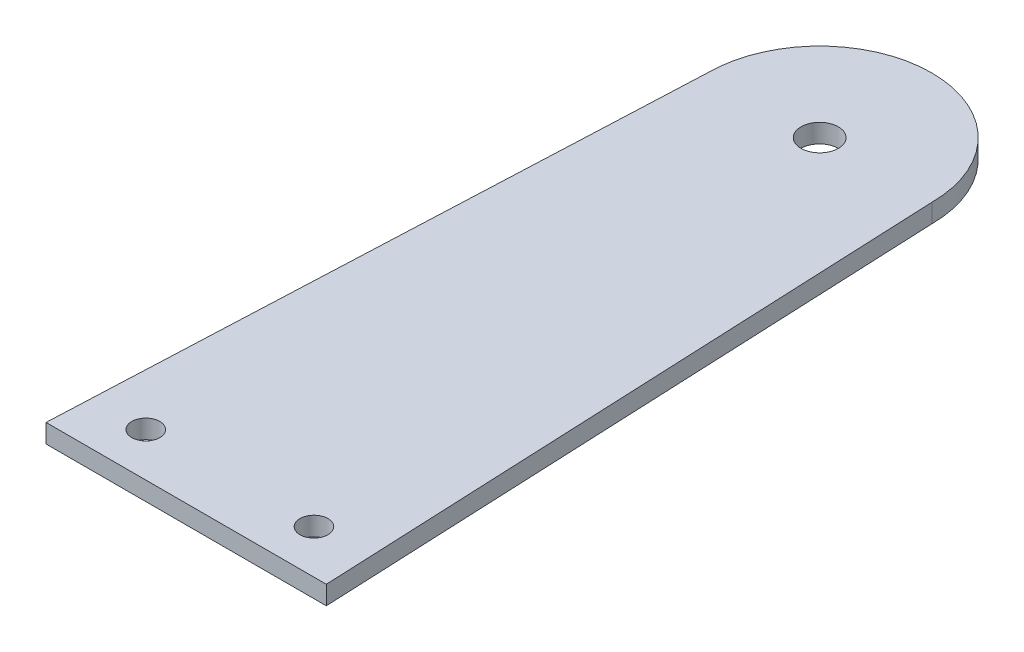
ISO-10303-21;
HEADER;
FILE_DESCRIPTION(('STEP AP214'),'2;1');
FILE_NAME('part.step','',(''),(''),'','','');
FILE_SCHEMA(('AUTOMOTIVE_DESIGN { 1 0 10303 214 1 1 1 1 }'));
ENDSEC;
DATA;
#1=APPLICATION_CONTEXT('core data for automotive mechanical design processes');
#2=APPLICATION_PROTOCOL_DEFINITION('international standard','automotive_design',2000,#1);
#3=PRODUCT_CONTEXT('',#1,'mechanical');
#4=PRODUCT('Part','Part','',(#3));
#5=PRODUCT_RELATED_PRODUCT_CATEGORY('part','',(#4));
#6=PRODUCT_DEFINITION_FORMATION('','',#4);
#7=PRODUCT_DEFINITION_CONTEXT('part definition',#1,'design');
#8=PRODUCT_DEFINITION('design','',#6,#7);
#9=PRODUCT_DEFINITION_SHAPE('','',#8);
#10=(LENGTH_UNIT() NAMED_UNIT(*) SI_UNIT(.MILLI.,.METRE.));
#11=(NAMED_UNIT(*) PLANE_ANGLE_UNIT() SI_UNIT($,.RADIAN.));
#12=(NAMED_UNIT(*) SI_UNIT($,.STERADIAN.) SOLID_ANGLE_UNIT());
#13=UNCERTAINTY_MEASURE_WITH_UNIT(LENGTH_MEASURE(1.E-05),#10,'distance_accuracy_value','');
#14=(GEOMETRIC_REPRESENTATION_CONTEXT(3) GLOBAL_UNCERTAINTY_ASSIGNED_CONTEXT((#13)) GLOBAL_UNIT_ASSIGNED_CONTEXT((#10,
#11,#12)) REPRESENTATION_CONTEXT('',''));
#15=CARTESIAN_POINT('',(0.,0.,0.));
#16=DIRECTION('',(0.,0.,1.));
#17=DIRECTION('',(1.,0.,0.));
#18=AXIS2_PLACEMENT_3D('',#15,#16,#17);
#19=CARTESIAN_POINT('',(-2.62522791540278,2.,-38.1827211912994));
#20=DIRECTION('',(0.,1.,0.));
#21=DIRECTION('',(0.,0.,1.));
#22=AXIS2_PLACEMENT_3D('',#19,#20,#21);
#23=PLANE('',#22);
#24=CARTESIAN_POINT('',(6.37477208459722,2.,24.9379456374754));
#25=DIRECTION('',(0.,1.,0.));
#26=DIRECTION('',(0.,0.,1.));
#27=AXIS2_PLACEMENT_3D('',#24,#25,#26);
#28=CIRCLE('',#27,1.5);
#29=CARTESIAN_POINT('',(6.37477208459722,2.,26.4379456374754));
#30=VERTEX_POINT('',#29);
#31=EDGE_CURVE('E116',#30,#30,#28,.T.);
#32=ORIENTED_EDGE('',*,*,#31,.F.);
#33=EDGE_LOOP('',(#32));
#34=FACE_BOUND('',#33,.T.);
#35=DIRECTION('',(-0.04420453547656,0.,0.999022501770256));
#36=VECTOR('',#35,1.);
#37=CARTESIAN_POINT('',(-14.6252279154028,2.,-38.1827211912994));
#38=LINE('',#37,#36);
#39=CARTESIAN_POINT('',(-14.6252279154028,2.,-38.1827211912994));
#40=VERTEX_POINT('',#39);
#41=CARTESIAN_POINT('',(-17.6252279154028,2.,29.6172788087006));
#42=VERTEX_POINT('',#41);
#43=EDGE_CURVE('E86',#40,#42,#38,.T.);
#44=ORIENTED_EDGE('',*,*,#43,.T.);
#45=DIRECTION('',(1.,0.,0.));
#46=VECTOR('',#45,1.);
#47=CARTESIAN_POINT('',(-17.6252279154028,2.,29.6172788087006));
#48=LINE('',#47,#46);
#49=CARTESIAN_POINT('',(12.3747720845972,2.,29.6172788087006));
#50=VERTEX_POINT('',#49);
#51=EDGE_CURVE('E81',#42,#50,#48,.T.);
#52=ORIENTED_EDGE('',*,*,#51,.T.);
#53=DIRECTION('',(-0.04420453547656,0.,-0.999022501770256));
#54=VECTOR('',#53,1.);
#55=CARTESIAN_POINT('',(9.37477208459723,2.,-38.1827211912994));
#56=LINE('',#55,#54);
#57=CARTESIAN_POINT('',(9.37477208459723,2.,-38.1827211912994));
#58=VERTEX_POINT('',#57);
#59=EDGE_CURVE('E84',#50,#58,#56,.T.);
#60=ORIENTED_EDGE('',*,*,#59,.T.);
#61=CARTESIAN_POINT('',(-2.62522791540278,2.,-38.1827211912994));
#62=DIRECTION('',(0.,1.,0.));
#63=DIRECTION('',(0.,0.,1.));
#64=AXIS2_PLACEMENT_3D('',#61,#62,#63);
#65=CIRCLE('',#64,12.);
#66=EDGE_CURVE('E51',#58,#40,#65,.T.);
#67=ORIENTED_EDGE('',*,*,#66,.T.);
#68=EDGE_LOOP('',(#44,#52,#60,#67));
#69=FACE_BOUND('',#68,.T.);
#70=CARTESIAN_POINT('',(-11.6252279154028,2.,24.9379456374754));
#71=DIRECTION('',(0.,1.,0.));
#72=DIRECTION('',(0.,0.,1.));
#73=AXIS2_PLACEMENT_3D('',#70,#71,#72);
#74=CIRCLE('',#73,1.5);
#75=CARTESIAN_POINT('',(-11.6252279154028,2.,26.4379456374754));
#76=VERTEX_POINT('',#75);
#77=EDGE_CURVE('E101',#76,#76,#74,.T.);
#78=ORIENTED_EDGE('',*,*,#77,.F.);
#79=EDGE_LOOP('',(#78));
#80=FACE_BOUND('',#79,.T.);
#81=CARTESIAN_POINT('',(-2.62522791540278,2.,-38.1827211912994));
#82=DIRECTION('',(0.,1.,0.));
#83=DIRECTION('',(0.,0.,1.));
#84=AXIS2_PLACEMENT_3D('',#81,#82,#83);
#85=CIRCLE('',#84,2.);
#86=CARTESIAN_POINT('',(-2.62522791540278,2.,-36.1827211912994));
#87=VERTEX_POINT('',#86);
#88=EDGE_CURVE('E122',#87,#87,#85,.T.);
#89=ORIENTED_EDGE('',*,*,#88,.F.);
#90=EDGE_LOOP('',(#89));
#91=FACE_BOUND('',#90,.T.);
#92=ADVANCED_FACE('F34',(#34,#69,#80,#91),#23,.T.);
#93=CARTESIAN_POINT('',(-2.62522791540278,0.,-38.1827211912994));
#94=DIRECTION('',(0.,1.,0.));
#95=DIRECTION('',(0.,0.,1.));
#96=AXIS2_PLACEMENT_3D('',#93,#94,#95);
#97=PLANE('',#96);
#98=DIRECTION('',(-0.04420453547656,0.,0.999022501770256));
#99=VECTOR('',#98,1.);
#100=CARTESIAN_POINT('',(-14.6252279154028,0.,-38.1827211912994));
#101=LINE('',#100,#99);
#102=CARTESIAN_POINT('',(-14.6252279154028,0.,-38.1827211912994));
#103=VERTEX_POINT('',#102);
#104=CARTESIAN_POINT('',(-17.6252279154028,0.,29.6172788087006));
#105=VERTEX_POINT('',#104);
#106=EDGE_CURVE('E98',#103,#105,#101,.T.);
#107=ORIENTED_EDGE('',*,*,#106,.F.);
#108=CARTESIAN_POINT('',(-2.62522791540278,0.,-38.1827211912994));
#109=DIRECTION('',(0.,1.,0.));
#110=DIRECTION('',(0.,0.,1.));
#111=AXIS2_PLACEMENT_3D('',#108,#109,#110);
#112=CIRCLE('',#111,12.);
#113=CARTESIAN_POINT('',(9.37477208459723,0.,-38.1827211912994));
#114=VERTEX_POINT('',#113);
#115=EDGE_CURVE('E74',#114,#103,#112,.T.);
#116=ORIENTED_EDGE('',*,*,#115,.F.);
#117=DIRECTION('',(-0.04420453547656,0.,-0.999022501770256));
#118=VECTOR('',#117,1.);
#119=CARTESIAN_POINT('',(9.37477208459723,0.,-38.1827211912994));
#120=LINE('',#119,#118);
#121=CARTESIAN_POINT('',(12.3747720845972,0.,29.6172788087006));
#122=VERTEX_POINT('',#121);
#123=EDGE_CURVE('E68',#122,#114,#120,.T.);
#124=ORIENTED_EDGE('',*,*,#123,.F.);
#125=DIRECTION('',(1.,0.,0.));
#126=VECTOR('',#125,1.);
#127=CARTESIAN_POINT('',(-17.6252279154028,0.,29.6172788087006));
#128=LINE('',#127,#126);
#129=EDGE_CURVE('E90',#105,#122,#128,.T.);
#130=ORIENTED_EDGE('',*,*,#129,.F.);
#131=EDGE_LOOP('',(#107,#116,#124,#130));
#132=FACE_BOUND('',#131,.T.);
#133=CARTESIAN_POINT('',(-11.6252279154028,0.,24.9379456374754));
#134=DIRECTION('',(0.,1.,0.));
#135=DIRECTION('',(0.,0.,1.));
#136=AXIS2_PLACEMENT_3D('',#133,#134,#135);
#137=CIRCLE('',#136,1.5);
#138=CARTESIAN_POINT('',(-11.6252279154028,0.,26.4379456374754));
#139=VERTEX_POINT('',#138);
#140=EDGE_CURVE('E113',#139,#139,#137,.T.);
#141=ORIENTED_EDGE('',*,*,#140,.T.);
#142=EDGE_LOOP('',(#141));
#143=FACE_BOUND('',#142,.T.);
#144=CARTESIAN_POINT('',(6.37477208459722,0.,24.9379456374754));
#145=DIRECTION('',(0.,1.,0.));
#146=DIRECTION('',(0.,0.,1.));
#147=AXIS2_PLACEMENT_3D('',#144,#145,#146);
#148=CIRCLE('',#147,1.5);
#149=CARTESIAN_POINT('',(6.37477208459722,0.,26.4379456374754));
#150=VERTEX_POINT('',#149);
#151=EDGE_CURVE('E119',#150,#150,#148,.T.);
#152=ORIENTED_EDGE('',*,*,#151,.T.);
#153=EDGE_LOOP('',(#152));
#154=FACE_BOUND('',#153,.T.);
#155=CARTESIAN_POINT('',(-2.62522791540278,0.,-38.1827211912994));
#156=DIRECTION('',(0.,1.,0.));
#157=DIRECTION('',(0.,0.,1.));
#158=AXIS2_PLACEMENT_3D('',#155,#156,#157);
#159=CIRCLE('',#158,2.);
#160=CARTESIAN_POINT('',(-2.62522791540278,0.,-36.1827211912994));
#161=VERTEX_POINT('',#160);
#162=EDGE_CURVE('E125',#161,#161,#159,.T.);
#163=ORIENTED_EDGE('',*,*,#162,.T.);
#164=EDGE_LOOP('',(#163));
#165=FACE_BOUND('',#164,.T.);
#166=ADVANCED_FACE('F109',(#132,#143,#154,#165),#97,.F.);
#167=CARTESIAN_POINT('',(-14.6252279154028,2.,-38.1827211912994));
#168=DIRECTION('',(0.999022501770256,0.,0.04420453547656));
#169=DIRECTION('',(0.04420453547656,0.,-0.999022501770256));
#170=AXIS2_PLACEMENT_3D('',#167,#168,#169);
#171=PLANE('',#170);
#172=ORIENTED_EDGE('',*,*,#106,.T.);
#173=DIRECTION('',(0.,-1.,0.));
#174=VECTOR('',#173,1.);
#175=CARTESIAN_POINT('',(-17.6252279154028,2.,29.6172788087006));
#176=LINE('',#175,#174);
#177=EDGE_CURVE('E11',#42,#105,#176,.T.);
#178=ORIENTED_EDGE('',*,*,#177,.F.);
#179=ORIENTED_EDGE('',*,*,#43,.F.);
#180=DIRECTION('',(0.,-1.,0.));
#181=VECTOR('',#180,1.);
#182=CARTESIAN_POINT('',(-14.6252279154028,2.,-38.1827211912994));
#183=LINE('',#182,#181);
#184=EDGE_CURVE('E94',#40,#103,#183,.T.);
#185=ORIENTED_EDGE('',*,*,#184,.T.);
#186=EDGE_LOOP('',(#172,#178,#179,#185));
#187=FACE_BOUND('',#186,.T.);
#188=ADVANCED_FACE('F36',(#187),#171,.F.);
#189=CARTESIAN_POINT('',(-17.6252279154028,2.,29.6172788087006));
#190=DIRECTION('',(0.,0.,-1.));
#191=DIRECTION('',(-1.,0.,0.));
#192=AXIS2_PLACEMENT_3D('',#189,#190,#191);
#193=PLANE('',#192);
#194=ORIENTED_EDGE('',*,*,#129,.T.);
#195=DIRECTION('',(0.,-1.,0.));
#196=VECTOR('',#195,1.);
#197=CARTESIAN_POINT('',(12.3747720845972,2.,29.6172788087006));
#198=LINE('',#197,#196);
#199=EDGE_CURVE('E43',#50,#122,#198,.T.);
#200=ORIENTED_EDGE('',*,*,#199,.F.);
#201=ORIENTED_EDGE('',*,*,#51,.F.);
#202=ORIENTED_EDGE('',*,*,#177,.T.);
#203=EDGE_LOOP('',(#194,#200,#201,#202));
#204=FACE_BOUND('',#203,.T.);
#205=ADVANCED_FACE('F89',(#204),#193,.F.);
#206=CARTESIAN_POINT('',(9.37477208459723,2.,-38.1827211912994));
#207=DIRECTION('',(-0.999022501770256,0.,0.04420453547656));
#208=DIRECTION('',(0.04420453547656,0.,0.999022501770256));
#209=AXIS2_PLACEMENT_3D('',#206,#207,#208);
#210=PLANE('',#209);
#211=ORIENTED_EDGE('',*,*,#123,.T.);
#212=DIRECTION('',(0.,-1.,0.));
#213=VECTOR('',#212,1.);
#214=CARTESIAN_POINT('',(9.37477208459723,2.,-38.1827211912994));
#215=LINE('',#214,#213);
#216=EDGE_CURVE('E91',#58,#114,#215,.T.);
#217=ORIENTED_EDGE('',*,*,#216,.F.);
#218=ORIENTED_EDGE('',*,*,#59,.F.);
#219=ORIENTED_EDGE('',*,*,#199,.T.);
#220=EDGE_LOOP('',(#211,#217,#218,#219));
#221=FACE_BOUND('',#220,.T.);
#222=ADVANCED_FACE('F92',(#221),#210,.F.);
#223=CARTESIAN_POINT('',(-2.62522791540278,2.,-38.1827211912994));
#224=DIRECTION('',(0.,-1.,0.));
#225=DIRECTION('',(0.,0.,-1.));
#226=AXIS2_PLACEMENT_3D('',#223,#224,#225);
#227=CYLINDRICAL_SURFACE('',#226,12.);
#228=ORIENTED_EDGE('',*,*,#115,.T.);
#229=ORIENTED_EDGE('',*,*,#184,.F.);
#230=ORIENTED_EDGE('',*,*,#66,.F.);
#231=ORIENTED_EDGE('',*,*,#216,.T.);
#232=EDGE_LOOP('',(#228,#229,#230,#231));
#233=FACE_BOUND('',#232,.T.);
#234=ADVANCED_FACE('F106',(#233),#227,.T.);
#235=CARTESIAN_POINT('',(-11.6252279154028,2.,24.9379456374754));
#236=DIRECTION('',(0.,-1.,0.));
#237=DIRECTION('',(0.,0.,-1.));
#238=AXIS2_PLACEMENT_3D('',#235,#236,#237);
#239=CYLINDRICAL_SURFACE('',#238,1.5);
#240=ORIENTED_EDGE('',*,*,#77,.T.);
#241=EDGE_LOOP('',(#240));
#242=FACE_BOUND('',#241,.T.);
#243=ORIENTED_EDGE('',*,*,#140,.F.);
#244=EDGE_LOOP('',(#243));
#245=FACE_BOUND('',#244,.T.);
#246=ADVANCED_FACE('F143',(#242,#245),#239,.F.);
#247=CARTESIAN_POINT('',(6.37477208459722,2.,24.9379456374754));
#248=DIRECTION('',(0.,-1.,0.));
#249=DIRECTION('',(0.,0.,-1.));
#250=AXIS2_PLACEMENT_3D('',#247,#248,#249);
#251=CYLINDRICAL_SURFACE('',#250,1.5);
#252=ORIENTED_EDGE('',*,*,#31,.T.);
#253=EDGE_LOOP('',(#252));
#254=FACE_BOUND('',#253,.T.);
#255=ORIENTED_EDGE('',*,*,#151,.F.);
#256=EDGE_LOOP('',(#255));
#257=FACE_BOUND('',#256,.T.);
#258=ADVANCED_FACE('F189',(#254,#257),#251,.F.);
#259=CARTESIAN_POINT('',(-2.62522791540278,2.,-38.1827211912994));
#260=DIRECTION('',(0.,-1.,0.));
#261=DIRECTION('',(0.,0.,-1.));
#262=AXIS2_PLACEMENT_3D('',#259,#260,#261);
#263=CYLINDRICAL_SURFACE('',#262,2.);
#264=ORIENTED_EDGE('',*,*,#88,.T.);
#265=EDGE_LOOP('',(#264));
#266=FACE_BOUND('',#265,.T.);
#267=ORIENTED_EDGE('',*,*,#162,.F.);
#268=EDGE_LOOP('',(#267));
#269=FACE_BOUND('',#268,.T.);
#270=ADVANCED_FACE('F131',(#266,#269),#263,.F.);
#271=CLOSED_SHELL('',(#92,#166,#188,#205,#222,#234,#246,#258,#270));
#272=MANIFOLD_SOLID_BREP('B2',#271);
#273=ADVANCED_BREP_SHAPE_REPRESENTATION('',(#18,#272),#14);
#274=SHAPE_DEFINITION_REPRESENTATION(#9,#273);
ENDSEC;
END-ISO-10303-21;
